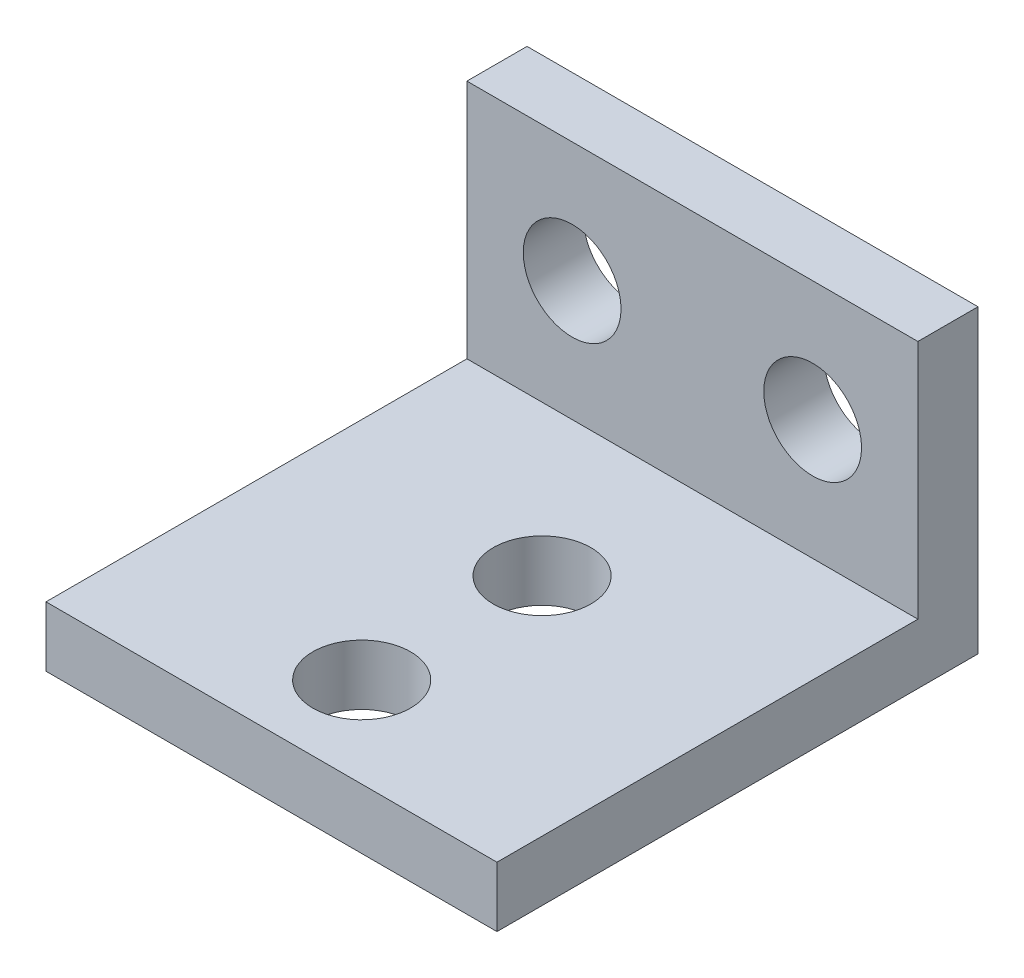
ISO-10303-21;
HEADER;
FILE_DESCRIPTION(('STEP AP214'),'2;1');
FILE_NAME('part.step','',(''),(''),'','','');
FILE_SCHEMA(('AUTOMOTIVE_DESIGN { 1 0 10303 214 1 1 1 1 }'));
ENDSEC;
DATA;
#1=APPLICATION_CONTEXT('core data for automotive mechanical design processes');
#2=APPLICATION_PROTOCOL_DEFINITION('international standard','automotive_design',2000,#1);
#3=PRODUCT_CONTEXT('',#1,'mechanical');
#4=PRODUCT('Part','Part','',(#3));
#5=PRODUCT_RELATED_PRODUCT_CATEGORY('part','',(#4));
#6=PRODUCT_DEFINITION_FORMATION('','',#4);
#7=PRODUCT_DEFINITION_CONTEXT('part definition',#1,'design');
#8=PRODUCT_DEFINITION('design','',#6,#7);
#9=PRODUCT_DEFINITION_SHAPE('','',#8);
#10=(LENGTH_UNIT() NAMED_UNIT(*) SI_UNIT(.MILLI.,.METRE.));
#11=(NAMED_UNIT(*) PLANE_ANGLE_UNIT() SI_UNIT($,.RADIAN.));
#12=(NAMED_UNIT(*) SI_UNIT($,.STERADIAN.) SOLID_ANGLE_UNIT());
#13=UNCERTAINTY_MEASURE_WITH_UNIT(LENGTH_MEASURE(1.E-05),#10,'distance_accuracy_value','');
#14=(GEOMETRIC_REPRESENTATION_CONTEXT(3) GLOBAL_UNCERTAINTY_ASSIGNED_CONTEXT((#13)) GLOBAL_UNIT_ASSIGNED_CONTEXT((#10,
#11,#12)) REPRESENTATION_CONTEXT('',''));
#15=CARTESIAN_POINT('',(0.,0.,0.));
#16=DIRECTION('',(0.,0.,1.));
#17=DIRECTION('',(1.,0.,0.));
#18=AXIS2_PLACEMENT_3D('',#15,#16,#17);
#19=CARTESIAN_POINT('',(0.,5.,26.));
#20=DIRECTION('',(0.,-1.,0.));
#21=DIRECTION('',(0.,0.,1.));
#22=AXIS2_PLACEMENT_3D('',#19,#20,#21);
#23=CYLINDRICAL_SURFACE('',#22,3.25);
#24=CARTESIAN_POINT('',(0.,0.,26.));
#25=DIRECTION('',(0.,-1.,0.));
#26=DIRECTION('',(0.,0.,1.));
#27=AXIS2_PLACEMENT_3D('',#24,#25,#26);
#28=CIRCLE('',#27,3.25);
#29=CARTESIAN_POINT('',(0.,0.,29.25));
#30=VERTEX_POINT('',#29);
#31=EDGE_CURVE('E134',#30,#30,#28,.T.);
#32=ORIENTED_EDGE('',*,*,#31,.T.);
#33=EDGE_LOOP('',(#32));
#34=FACE_BOUND('',#33,.T.);
#35=CARTESIAN_POINT('',(0.,4.,26.));
#36=DIRECTION('',(0.,-1.,0.));
#37=DIRECTION('',(0.,0.,1.));
#38=AXIS2_PLACEMENT_3D('',#35,#36,#37);
#39=CIRCLE('',#38,3.25);
#40=CARTESIAN_POINT('',(0.,4.,29.25));
#41=VERTEX_POINT('',#40);
#42=EDGE_CURVE('E10',#41,#41,#39,.T.);
#43=ORIENTED_EDGE('',*,*,#42,.F.);
#44=EDGE_LOOP('',(#43));
#45=FACE_BOUND('',#44,.T.);
#46=ADVANCED_FACE('F16',(#34,#45),#23,.F.);
#47=CARTESIAN_POINT('',(0.,5.,14.));
#48=DIRECTION('',(0.,-1.,0.));
#49=DIRECTION('',(0.,0.,1.));
#50=AXIS2_PLACEMENT_3D('',#47,#48,#49);
#51=CYLINDRICAL_SURFACE('',#50,3.25);
#52=CARTESIAN_POINT('',(0.,0.,14.));
#53=DIRECTION('',(0.,-1.,0.));
#54=DIRECTION('',(0.,0.,1.));
#55=AXIS2_PLACEMENT_3D('',#52,#53,#54);
#56=CIRCLE('',#55,3.25);
#57=CARTESIAN_POINT('',(0.,0.,17.25));
#58=VERTEX_POINT('',#57);
#59=EDGE_CURVE('E138',#58,#58,#56,.T.);
#60=ORIENTED_EDGE('',*,*,#59,.T.);
#61=EDGE_LOOP('',(#60));
#62=FACE_BOUND('',#61,.T.);
#63=CARTESIAN_POINT('',(0.,4.,14.));
#64=DIRECTION('',(0.,-1.,0.));
#65=DIRECTION('',(0.,0.,1.));
#66=AXIS2_PLACEMENT_3D('',#63,#64,#65);
#67=CIRCLE('',#66,3.25);
#68=CARTESIAN_POINT('',(0.,4.,17.25));
#69=VERTEX_POINT('',#68);
#70=EDGE_CURVE('E25',#69,#69,#67,.T.);
#71=ORIENTED_EDGE('',*,*,#70,.F.);
#72=EDGE_LOOP('',(#71));
#73=FACE_BOUND('',#72,.T.);
#74=ADVANCED_FACE('F171',(#62,#73),#51,.F.);
#75=CARTESIAN_POINT('',(-8.,12.,-1.));
#76=DIRECTION('',(0.,0.,1.));
#77=DIRECTION('',(-1.,0.,0.));
#78=AXIS2_PLACEMENT_3D('',#75,#76,#77);
#79=CYLINDRICAL_SURFACE('',#78,3.25);
#80=CARTESIAN_POINT('',(-8.,12.,4.));
#81=DIRECTION('',(0.,0.,1.));
#82=DIRECTION('',(-1.,0.,0.));
#83=AXIS2_PLACEMENT_3D('',#80,#81,#82);
#84=CIRCLE('',#83,3.25);
#85=CARTESIAN_POINT('',(-11.25,12.,4.));
#86=VERTEX_POINT('',#85);
#87=EDGE_CURVE('E109',#86,#86,#84,.T.);
#88=ORIENTED_EDGE('',*,*,#87,.T.);
#89=EDGE_LOOP('',(#88));
#90=FACE_BOUND('',#89,.T.);
#91=CARTESIAN_POINT('',(-8.,12.,0.));
#92=DIRECTION('',(0.,0.,1.));
#93=DIRECTION('',(-1.,0.,0.));
#94=AXIS2_PLACEMENT_3D('',#91,#92,#93);
#95=CIRCLE('',#94,3.25);
#96=CARTESIAN_POINT('',(-11.25,12.,0.));
#97=VERTEX_POINT('',#96);
#98=EDGE_CURVE('E145',#97,#97,#95,.T.);
#99=ORIENTED_EDGE('',*,*,#98,.F.);
#100=EDGE_LOOP('',(#99));
#101=FACE_BOUND('',#100,.T.);
#102=ADVANCED_FACE('F173',(#90,#101),#79,.F.);
#103=CARTESIAN_POINT('',(8.,12.,-1.));
#104=DIRECTION('',(0.,0.,1.));
#105=DIRECTION('',(-1.,0.,0.));
#106=AXIS2_PLACEMENT_3D('',#103,#104,#105);
#107=CYLINDRICAL_SURFACE('',#106,3.25);
#108=CARTESIAN_POINT('',(8.,12.,4.));
#109=DIRECTION('',(0.,0.,1.));
#110=DIRECTION('',(-1.,0.,0.));
#111=AXIS2_PLACEMENT_3D('',#108,#109,#110);
#112=CIRCLE('',#111,3.25);
#113=CARTESIAN_POINT('',(4.75,12.,4.));
#114=VERTEX_POINT('',#113);
#115=EDGE_CURVE('E116',#114,#114,#112,.T.);
#116=ORIENTED_EDGE('',*,*,#115,.T.);
#117=EDGE_LOOP('',(#116));
#118=FACE_BOUND('',#117,.T.);
#119=CARTESIAN_POINT('',(8.,12.,0.));
#120=DIRECTION('',(0.,0.,1.));
#121=DIRECTION('',(-1.,0.,0.));
#122=AXIS2_PLACEMENT_3D('',#119,#120,#121);
#123=CIRCLE('',#122,3.25);
#124=CARTESIAN_POINT('',(4.75,12.,0.));
#125=VERTEX_POINT('',#124);
#126=EDGE_CURVE('E92',#125,#125,#123,.T.);
#127=ORIENTED_EDGE('',*,*,#126,.F.);
#128=EDGE_LOOP('',(#127));
#129=FACE_BOUND('',#128,.T.);
#130=ADVANCED_FACE('F18',(#118,#129),#107,.F.);
#131=CARTESIAN_POINT('',(-15.,20.,0.));
#132=DIRECTION('',(-1.,0.,0.));
#133=DIRECTION('',(0.,0.,1.));
#134=AXIS2_PLACEMENT_3D('',#131,#132,#133);
#135=PLANE('',#134);
#136=DIRECTION('',(0.,-1.,0.));
#137=VECTOR('',#136,1.);
#138=CARTESIAN_POINT('',(-15.,20.,4.));
#139=LINE('',#138,#137);
#140=CARTESIAN_POINT('',(-15.,20.,4.));
#141=VERTEX_POINT('',#140);
#142=CARTESIAN_POINT('',(-15.,4.,4.));
#143=VERTEX_POINT('',#142);
#144=EDGE_CURVE('E106',#141,#143,#139,.T.);
#145=ORIENTED_EDGE('',*,*,#144,.F.);
#146=DIRECTION('',(0.,0.,1.));
#147=VECTOR('',#146,1.);
#148=CARTESIAN_POINT('',(-15.,20.,0.));
#149=LINE('',#148,#147);
#150=CARTESIAN_POINT('',(-15.,20.,0.));
#151=VERTEX_POINT('',#150);
#152=EDGE_CURVE('E97',#151,#141,#149,.T.);
#153=ORIENTED_EDGE('',*,*,#152,.F.);
#154=DIRECTION('',(0.,-1.,0.));
#155=VECTOR('',#154,1.);
#156=CARTESIAN_POINT('',(-15.,20.,0.));
#157=LINE('',#156,#155);
#158=CARTESIAN_POINT('',(-15.,0.,0.));
#159=VERTEX_POINT('',#158);
#160=EDGE_CURVE('E82',#151,#159,#157,.T.);
#161=ORIENTED_EDGE('',*,*,#160,.T.);
#162=DIRECTION('',(0.,0.,-1.));
#163=VECTOR('',#162,1.);
#164=CARTESIAN_POINT('',(-15.,0.,32.));
#165=LINE('',#164,#163);
#166=CARTESIAN_POINT('',(-15.,0.,32.));
#167=VERTEX_POINT('',#166);
#168=EDGE_CURVE('E144',#167,#159,#165,.T.);
#169=ORIENTED_EDGE('',*,*,#168,.F.);
#170=DIRECTION('',(0.,-1.,0.));
#171=VECTOR('',#170,1.);
#172=CARTESIAN_POINT('',(-15.,4.,32.));
#173=LINE('',#172,#171);
#174=CARTESIAN_POINT('',(-15.,4.,32.));
#175=VERTEX_POINT('',#174);
#176=EDGE_CURVE('E49',#175,#167,#173,.T.);
#177=ORIENTED_EDGE('',*,*,#176,.F.);
#178=DIRECTION('',(0.,0.,1.));
#179=VECTOR('',#178,1.);
#180=CARTESIAN_POINT('',(-15.,4.,3.));
#181=LINE('',#180,#179);
#182=EDGE_CURVE('E37',#143,#175,#181,.T.);
#183=ORIENTED_EDGE('',*,*,#182,.F.);
#184=EDGE_LOOP('',(#145,#153,#161,#169,#177,#183));
#185=FACE_BOUND('',#184,.T.);
#186=ADVANCED_FACE('F104',(#185),#135,.T.);
#187=CARTESIAN_POINT('',(15.,4.,3.));
#188=DIRECTION('',(0.,-1.,0.));
#189=DIRECTION('',(-1.,0.,0.));
#190=AXIS2_PLACEMENT_3D('',#187,#188,#189);
#191=PLANE('',#190);
#192=ORIENTED_EDGE('',*,*,#42,.T.);
#193=EDGE_LOOP('',(#192));
#194=FACE_BOUND('',#193,.T.);
#195=ORIENTED_EDGE('',*,*,#70,.T.);
#196=EDGE_LOOP('',(#195));
#197=FACE_BOUND('',#196,.T.);
#198=DIRECTION('',(-1.,0.,0.));
#199=VECTOR('',#198,1.);
#200=CARTESIAN_POINT('',(15.,4.,32.));
#201=LINE('',#200,#199);
#202=CARTESIAN_POINT('',(15.,4.,32.));
#203=VERTEX_POINT('',#202);
#204=EDGE_CURVE('E137',#203,#175,#201,.T.);
#205=ORIENTED_EDGE('',*,*,#204,.F.);
#206=DIRECTION('',(0.,0.,1.));
#207=VECTOR('',#206,1.);
#208=CARTESIAN_POINT('',(15.,4.,3.));
#209=LINE('',#208,#207);
#210=CARTESIAN_POINT('',(15.,4.,4.));
#211=VERTEX_POINT('',#210);
#212=EDGE_CURVE('E236',#211,#203,#209,.T.);
#213=ORIENTED_EDGE('',*,*,#212,.F.);
#214=DIRECTION('',(1.,0.,0.));
#215=VECTOR('',#214,1.);
#216=CARTESIAN_POINT('',(15.,4.,4.));
#217=LINE('',#216,#215);
#218=EDGE_CURVE('E127',#143,#211,#217,.T.);
#219=ORIENTED_EDGE('',*,*,#218,.F.);
#220=ORIENTED_EDGE('',*,*,#182,.T.);
#221=EDGE_LOOP('',(#205,#213,#219,#220));
#222=FACE_BOUND('',#221,.T.);
#223=ADVANCED_FACE('F169',(#194,#197,#222),#191,.F.);
#224=CARTESIAN_POINT('',(15.,4.,32.));
#225=DIRECTION('',(0.,0.,1.));
#226=DIRECTION('',(1.,0.,0.));
#227=AXIS2_PLACEMENT_3D('',#224,#225,#226);
#228=PLANE('',#227);
#229=DIRECTION('',(0.,-1.,0.));
#230=VECTOR('',#229,1.);
#231=CARTESIAN_POINT('',(15.,4.,32.));
#232=LINE('',#231,#230);
#233=CARTESIAN_POINT('',(15.,0.,32.));
#234=VERTEX_POINT('',#233);
#235=EDGE_CURVE('E232',#203,#234,#232,.T.);
#236=ORIENTED_EDGE('',*,*,#235,.F.);
#237=ORIENTED_EDGE('',*,*,#204,.T.);
#238=ORIENTED_EDGE('',*,*,#176,.T.);
#239=DIRECTION('',(-1.,0.,0.));
#240=VECTOR('',#239,1.);
#241=CARTESIAN_POINT('',(15.,0.,32.));
#242=LINE('',#241,#240);
#243=EDGE_CURVE('E140',#234,#167,#242,.T.);
#244=ORIENTED_EDGE('',*,*,#243,.F.);
#245=EDGE_LOOP('',(#236,#237,#238,#244));
#246=FACE_BOUND('',#245,.T.);
#247=ADVANCED_FACE('F192',(#246),#228,.T.);
#248=CARTESIAN_POINT('',(15.,0.,0.));
#249=DIRECTION('',(0.,-1.,0.));
#250=DIRECTION('',(-1.,0.,0.));
#251=AXIS2_PLACEMENT_3D('',#248,#249,#250);
#252=PLANE('',#251);
#253=ORIENTED_EDGE('',*,*,#31,.F.);
#254=EDGE_LOOP('',(#253));
#255=FACE_BOUND('',#254,.T.);
#256=ORIENTED_EDGE('',*,*,#59,.F.);
#257=EDGE_LOOP('',(#256));
#258=FACE_BOUND('',#257,.T.);
#259=DIRECTION('',(-1.,0.,0.));
#260=VECTOR('',#259,1.);
#261=CARTESIAN_POINT('',(15.,0.,0.));
#262=LINE('',#261,#260);
#263=CARTESIAN_POINT('',(15.,0.,0.));
#264=VERTEX_POINT('',#263);
#265=EDGE_CURVE('E88',#264,#159,#262,.T.);
#266=ORIENTED_EDGE('',*,*,#265,.F.);
#267=DIRECTION('',(0.,0.,-1.));
#268=VECTOR('',#267,1.);
#269=CARTESIAN_POINT('',(15.,0.,32.));
#270=LINE('',#269,#268);
#271=EDGE_CURVE('E228',#234,#264,#270,.T.);
#272=ORIENTED_EDGE('',*,*,#271,.F.);
#273=ORIENTED_EDGE('',*,*,#243,.T.);
#274=ORIENTED_EDGE('',*,*,#168,.T.);
#275=EDGE_LOOP('',(#266,#272,#273,#274));
#276=FACE_BOUND('',#275,.T.);
#277=ADVANCED_FACE('F196',(#255,#258,#276),#252,.T.);
#278=CARTESIAN_POINT('',(15.,20.,0.));
#279=DIRECTION('',(0.,0.,1.));
#280=DIRECTION('',(1.,0.,0.));
#281=AXIS2_PLACEMENT_3D('',#278,#279,#280);
#282=PLANE('',#281);
#283=ORIENTED_EDGE('',*,*,#98,.T.);
#284=EDGE_LOOP('',(#283));
#285=FACE_BOUND('',#284,.T.);
#286=ORIENTED_EDGE('',*,*,#126,.T.);
#287=EDGE_LOOP('',(#286));
#288=FACE_BOUND('',#287,.T.);
#289=ORIENTED_EDGE('',*,*,#265,.T.);
#290=ORIENTED_EDGE('',*,*,#160,.F.);
#291=DIRECTION('',(-1.,0.,0.));
#292=VECTOR('',#291,1.);
#293=CARTESIAN_POINT('',(15.,20.,0.));
#294=LINE('',#293,#292);
#295=CARTESIAN_POINT('',(15.,20.,0.));
#296=VERTEX_POINT('',#295);
#297=EDGE_CURVE('E86',#296,#151,#294,.T.);
#298=ORIENTED_EDGE('',*,*,#297,.F.);
#299=DIRECTION('',(0.,-1.,0.));
#300=VECTOR('',#299,1.);
#301=CARTESIAN_POINT('',(15.,20.,0.));
#302=LINE('',#301,#300);
#303=EDGE_CURVE('E120',#296,#264,#302,.T.);
#304=ORIENTED_EDGE('',*,*,#303,.T.);
#305=EDGE_LOOP('',(#289,#290,#298,#304));
#306=FACE_BOUND('',#305,.T.);
#307=ADVANCED_FACE('F84',(#285,#288,#306),#282,.F.);
#308=CARTESIAN_POINT('',(15.,20.,0.));
#309=DIRECTION('',(0.,-1.,0.));
#310=DIRECTION('',(-1.,0.,0.));
#311=AXIS2_PLACEMENT_3D('',#308,#309,#310);
#312=PLANE('',#311);
#313=ORIENTED_EDGE('',*,*,#152,.T.);
#314=DIRECTION('',(-1.,0.,0.));
#315=VECTOR('',#314,1.);
#316=CARTESIAN_POINT('',(15.,20.,4.));
#317=LINE('',#316,#315);
#318=CARTESIAN_POINT('',(15.,20.,4.));
#319=VERTEX_POINT('',#318);
#320=EDGE_CURVE('E122',#319,#141,#317,.T.);
#321=ORIENTED_EDGE('',*,*,#320,.F.);
#322=DIRECTION('',(0.,0.,1.));
#323=VECTOR('',#322,1.);
#324=CARTESIAN_POINT('',(15.,20.,0.));
#325=LINE('',#324,#323);
#326=EDGE_CURVE('E100',#296,#319,#325,.T.);
#327=ORIENTED_EDGE('',*,*,#326,.F.);
#328=ORIENTED_EDGE('',*,*,#297,.T.);
#329=EDGE_LOOP('',(#313,#321,#327,#328));
#330=FACE_BOUND('',#329,.T.);
#331=ADVANCED_FACE('F96',(#330),#312,.F.);
#332=CARTESIAN_POINT('',(15.,20.,4.));
#333=DIRECTION('',(0.,0.,1.));
#334=DIRECTION('',(1.,0.,0.));
#335=AXIS2_PLACEMENT_3D('',#332,#333,#334);
#336=PLANE('',#335);
#337=ORIENTED_EDGE('',*,*,#87,.F.);
#338=EDGE_LOOP('',(#337));
#339=FACE_BOUND('',#338,.T.);
#340=ORIENTED_EDGE('',*,*,#115,.F.);
#341=EDGE_LOOP('',(#340));
#342=FACE_BOUND('',#341,.T.);
#343=DIRECTION('',(0.,-1.,0.));
#344=VECTOR('',#343,1.);
#345=CARTESIAN_POINT('',(15.,20.,4.));
#346=LINE('',#345,#344);
#347=EDGE_CURVE('E124',#319,#211,#346,.T.);
#348=ORIENTED_EDGE('',*,*,#347,.F.);
#349=ORIENTED_EDGE('',*,*,#320,.T.);
#350=ORIENTED_EDGE('',*,*,#144,.T.);
#351=ORIENTED_EDGE('',*,*,#218,.T.);
#352=EDGE_LOOP('',(#348,#349,#350,#351));
#353=FACE_BOUND('',#352,.T.);
#354=ADVANCED_FACE('F187',(#339,#342,#353),#336,.T.);
#355=CARTESIAN_POINT('',(15.,20.,0.));
#356=DIRECTION('',(-1.,0.,0.));
#357=DIRECTION('',(0.,0.,1.));
#358=AXIS2_PLACEMENT_3D('',#355,#356,#357);
#359=PLANE('',#358);
#360=ORIENTED_EDGE('',*,*,#212,.T.);
#361=ORIENTED_EDGE('',*,*,#235,.T.);
#362=ORIENTED_EDGE('',*,*,#271,.T.);
#363=ORIENTED_EDGE('',*,*,#303,.F.);
#364=ORIENTED_EDGE('',*,*,#326,.T.);
#365=ORIENTED_EDGE('',*,*,#347,.T.);
#366=EDGE_LOOP('',(#360,#361,#362,#363,#364,#365));
#367=FACE_BOUND('',#366,.T.);
#368=ADVANCED_FACE('F216',(#367),#359,.F.);
#369=CLOSED_SHELL('',(#46,#74,#102,#130,#186,#223,#247,#277,#307,#331,#354,#368));
#370=MANIFOLD_SOLID_BREP('B1',#369);
#371=ADVANCED_BREP_SHAPE_REPRESENTATION('',(#18,#370),#14);
#372=SHAPE_DEFINITION_REPRESENTATION(#9,#371);
ENDSEC;
END-ISO-10303-21;
